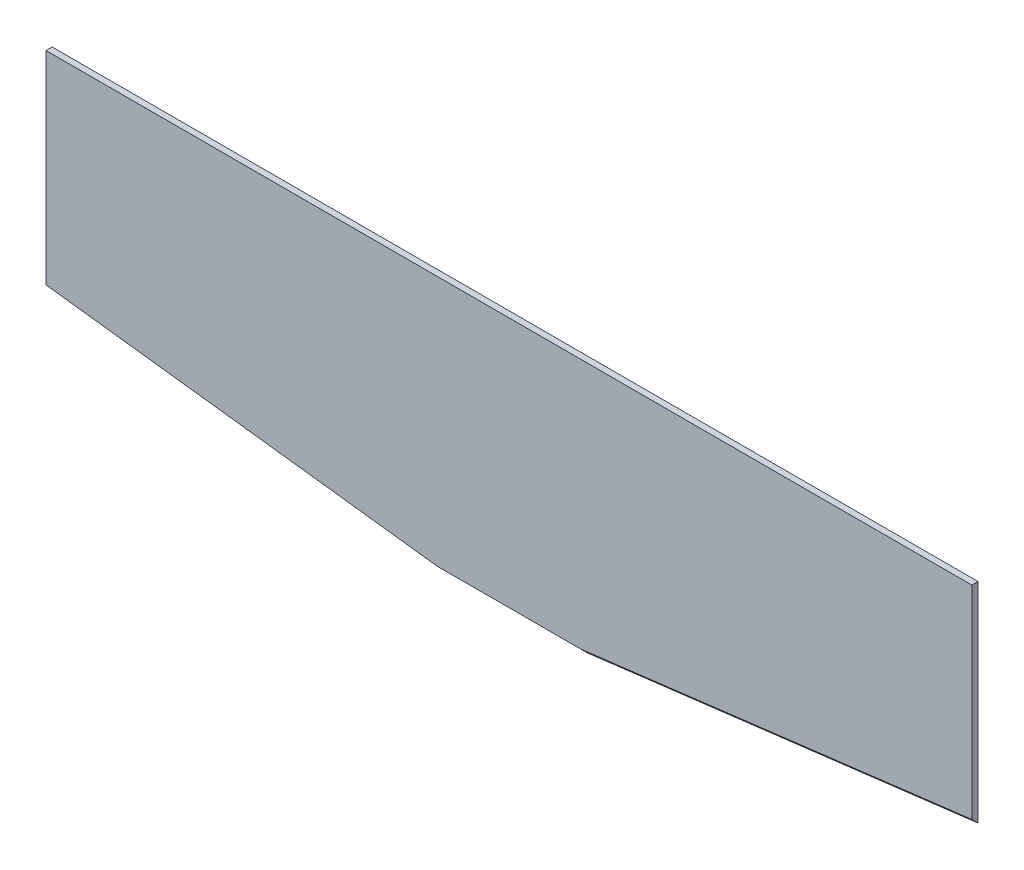
ISO-10303-21;
HEADER;
FILE_DESCRIPTION(('STEP AP214'),'2;1');
FILE_NAME('part.step','',(''),(''),'','','');
FILE_SCHEMA(('AUTOMOTIVE_DESIGN { 1 0 10303 214 1 1 1 1 }'));
ENDSEC;
DATA;
#1=APPLICATION_CONTEXT('core data for automotive mechanical design processes');
#2=APPLICATION_PROTOCOL_DEFINITION('international standard','automotive_design',2000,#1);
#3=PRODUCT_CONTEXT('',#1,'mechanical');
#4=PRODUCT('Part','Part','',(#3));
#5=PRODUCT_RELATED_PRODUCT_CATEGORY('part','',(#4));
#6=PRODUCT_DEFINITION_FORMATION('','',#4);
#7=PRODUCT_DEFINITION_CONTEXT('part definition',#1,'design');
#8=PRODUCT_DEFINITION('design','',#6,#7);
#9=PRODUCT_DEFINITION_SHAPE('','',#8);
#10=(LENGTH_UNIT() NAMED_UNIT(*) SI_UNIT(.MILLI.,.METRE.));
#11=(NAMED_UNIT(*) PLANE_ANGLE_UNIT() SI_UNIT($,.RADIAN.));
#12=(NAMED_UNIT(*) SI_UNIT($,.STERADIAN.) SOLID_ANGLE_UNIT());
#13=UNCERTAINTY_MEASURE_WITH_UNIT(LENGTH_MEASURE(1.E-05),#10,'distance_accuracy_value','');
#14=(GEOMETRIC_REPRESENTATION_CONTEXT(3) GLOBAL_UNCERTAINTY_ASSIGNED_CONTEXT((#13)) GLOBAL_UNIT_ASSIGNED_CONTEXT((#10,
#11,#12)) REPRESENTATION_CONTEXT('',''));
#15=CARTESIAN_POINT('',(0.,0.,0.));
#16=DIRECTION('',(0.,0.,1.));
#17=DIRECTION('',(1.,0.,0.));
#18=AXIS2_PLACEMENT_3D('',#15,#16,#17);
#19=CARTESIAN_POINT('',(-14.,9.,0.6));
#20=DIRECTION('',(1.,0.,0.));
#21=DIRECTION('',(0.,1.,0.));
#22=AXIS2_PLACEMENT_3D('',#19,#20,#21);
#23=PLANE('',#22);
#24=DIRECTION('',(0.,-1.,0.));
#25=VECTOR('',#24,1.);
#26=CARTESIAN_POINT('',(-14.,9.,0.));
#27=LINE('',#26,#25);
#28=CARTESIAN_POINT('',(-14.,9.,0.));
#29=VERTEX_POINT('',#28);
#30=CARTESIAN_POINT('',(-14.,-11.3341866856899,0.));
#31=VERTEX_POINT('',#30);
#32=EDGE_CURVE('E109',#29,#31,#27,.T.);
#33=ORIENTED_EDGE('',*,*,#32,.T.);
#34=DIRECTION('',(0.,0.709747006865423,0.704456660303225));
#35=VECTOR('',#34,1.);
#36=CARTESIAN_POINT('',(-14.,-13.6845472814667,-2.33284136430769));
#37=LINE('',#36,#35);
#38=CARTESIAN_POINT('',(-14.,-10.7296807904146,0.6));
#39=VERTEX_POINT('',#38);
#40=EDGE_CURVE('E11',#31,#39,#37,.T.);
#41=ORIENTED_EDGE('',*,*,#40,.T.);
#42=DIRECTION('',(0.,-1.,0.));
#43=VECTOR('',#42,1.);
#44=CARTESIAN_POINT('',(-14.,9.,0.6));
#45=LINE('',#44,#43);
#46=CARTESIAN_POINT('',(-14.,9.,0.6));
#47=VERTEX_POINT('',#46);
#48=EDGE_CURVE('E133',#47,#39,#45,.T.);
#49=ORIENTED_EDGE('',*,*,#48,.F.);
#50=DIRECTION('',(0.,0.,-1.));
#51=VECTOR('',#50,1.);
#52=CARTESIAN_POINT('',(-14.,9.,0.6));
#53=LINE('',#52,#51);
#54=EDGE_CURVE('E127',#47,#29,#53,.T.);
#55=ORIENTED_EDGE('',*,*,#54,.T.);
#56=EDGE_LOOP('',(#33,#41,#49,#55));
#57=FACE_BOUND('',#56,.T.);
#58=ADVANCED_FACE('F41',(#57),#23,.F.);
#59=CARTESIAN_POINT('',(76.,9.,0.6));
#60=DIRECTION('',(-1.,0.,0.));
#61=DIRECTION('',(0.,0.,1.));
#62=AXIS2_PLACEMENT_3D('',#59,#60,#61);
#63=PLANE('',#62);
#64=DIRECTION('',(0.,1.,0.));
#65=VECTOR('',#64,1.);
#66=CARTESIAN_POINT('',(76.,9.,0.6));
#67=LINE('',#66,#65);
#68=CARTESIAN_POINT('',(76.,-10.7296807904147,0.6));
#69=VERTEX_POINT('',#68);
#70=CARTESIAN_POINT('',(76.,9.,0.6));
#71=VERTEX_POINT('',#70);
#72=EDGE_CURVE('E137',#69,#71,#67,.T.);
#73=ORIENTED_EDGE('',*,*,#72,.F.);
#74=DIRECTION('',(0.,-0.709747006865421,-0.704456660303227));
#75=VECTOR('',#74,1.);
#76=CARTESIAN_POINT('',(76.,-13.6845472814667,-2.33284136430765));
#77=LINE('',#76,#75);
#78=CARTESIAN_POINT('',(76.,-11.33418668569,0.));
#79=VERTEX_POINT('',#78);
#80=EDGE_CURVE('E51',#69,#79,#77,.T.);
#81=ORIENTED_EDGE('',*,*,#80,.T.);
#82=DIRECTION('',(0.,1.,0.));
#83=VECTOR('',#82,1.);
#84=CARTESIAN_POINT('',(76.,9.,0.));
#85=LINE('',#84,#83);
#86=CARTESIAN_POINT('',(76.,9.,0.));
#87=VERTEX_POINT('',#86);
#88=EDGE_CURVE('E108',#79,#87,#85,.T.);
#89=ORIENTED_EDGE('',*,*,#88,.T.);
#90=DIRECTION('',(0.,0.,-1.));
#91=VECTOR('',#90,1.);
#92=CARTESIAN_POINT('',(76.,9.,0.6));
#93=LINE('',#92,#91);
#94=EDGE_CURVE('E124',#71,#87,#93,.T.);
#95=ORIENTED_EDGE('',*,*,#94,.F.);
#96=EDGE_LOOP('',(#73,#81,#89,#95));
#97=FACE_BOUND('',#96,.T.);
#98=ADVANCED_FACE('F150',(#97),#63,.F.);
#99=CARTESIAN_POINT('',(-14.,9.,0.6));
#100=DIRECTION('',(0.,-1.,0.));
#101=DIRECTION('',(0.,0.,-1.));
#102=AXIS2_PLACEMENT_3D('',#99,#100,#101);
#103=PLANE('',#102);
#104=DIRECTION('',(-1.,0.,0.));
#105=VECTOR('',#104,1.);
#106=CARTESIAN_POINT('',(-14.,9.,0.));
#107=LINE('',#106,#105);
#108=EDGE_CURVE('E131',#87,#29,#107,.T.);
#109=ORIENTED_EDGE('',*,*,#108,.T.);
#110=ORIENTED_EDGE('',*,*,#54,.F.);
#111=DIRECTION('',(-1.,0.,0.));
#112=VECTOR('',#111,1.);
#113=CARTESIAN_POINT('',(-14.,9.,0.6));
#114=LINE('',#113,#112);
#115=EDGE_CURVE('E130',#71,#47,#114,.T.);
#116=ORIENTED_EDGE('',*,*,#115,.F.);
#117=ORIENTED_EDGE('',*,*,#94,.T.);
#118=EDGE_LOOP('',(#109,#110,#116,#117));
#119=FACE_BOUND('',#118,.T.);
#120=ADVANCED_FACE('F146',(#119),#103,.F.);
#121=CARTESIAN_POINT('',(0.,0.,0.6));
#122=DIRECTION('',(0.,0.,1.));
#123=DIRECTION('',(1.,0.,0.));
#124=AXIS2_PLACEMENT_3D('',#121,#122,#123);
#125=PLANE('',#124);
#126=DIRECTION('',(1.,0.,0.));
#127=VECTOR('',#126,1.);
#128=CARTESIAN_POINT('',(38.,-15.4,0.6));
#129=LINE('',#128,#127);
#130=CARTESIAN_POINT('',(24.0366975720903,-15.4,0.6));
#131=VERTEX_POINT('',#130);
#132=CARTESIAN_POINT('',(37.9633024279098,-15.4,0.6));
#133=VERTEX_POINT('',#132);
#134=EDGE_CURVE('E59',#131,#133,#129,.T.);
#135=ORIENTED_EDGE('',*,*,#134,.T.);
#136=DIRECTION('',(0.992546151641323,0.121869343405138,0.));
#137=VECTOR('',#136,1.);
#138=CARTESIAN_POINT('',(75.9268783939569,-10.7386589947052,0.6));
#139=LINE('',#138,#137);
#140=EDGE_CURVE('E120',#133,#69,#139,.T.);
#141=ORIENTED_EDGE('',*,*,#140,.T.);
#142=ORIENTED_EDGE('',*,*,#72,.T.);
#143=ORIENTED_EDGE('',*,*,#115,.T.);
#144=ORIENTED_EDGE('',*,*,#48,.T.);
#145=DIRECTION('',(0.992546151641323,-0.121869343405141,0.));
#146=VECTOR('',#145,1.);
#147=CARTESIAN_POINT('',(24.0731216060431,-15.4044723090152,0.6));
#148=LINE('',#147,#146);
#149=EDGE_CURVE('E64',#39,#131,#148,.T.);
#150=ORIENTED_EDGE('',*,*,#149,.T.);
#151=EDGE_LOOP('',(#135,#141,#142,#143,#144,#150));
#152=FACE_BOUND('',#151,.T.);
#153=ADVANCED_FACE('F140',(#152),#125,.T.);
#154=CARTESIAN_POINT('',(0.,0.,0.));
#155=DIRECTION('',(0.,0.,1.));
#156=DIRECTION('',(1.,0.,0.));
#157=AXIS2_PLACEMENT_3D('',#154,#155,#156);
#158=PLANE('',#157);
#159=DIRECTION('',(1.,0.,0.));
#160=VECTOR('',#159,1.);
#161=CARTESIAN_POINT('',(-14.,-16.,0.));
#162=LINE('',#161,#160);
#163=CARTESIAN_POINT('',(23.9999999999996,-16.,0.));
#164=VERTEX_POINT('',#163);
#165=CARTESIAN_POINT('',(38.,-16.,0.));
#166=VERTEX_POINT('',#165);
#167=EDGE_CURVE('E96',#164,#166,#162,.T.);
#168=ORIENTED_EDGE('',*,*,#167,.F.);
#169=DIRECTION('',(0.992546151641323,-0.121869343405141,0.));
#170=VECTOR('',#169,1.);
#171=CARTESIAN_POINT('',(24.,-16.,0.));
#172=LINE('',#171,#170);
#173=EDGE_CURVE('E100',#31,#164,#172,.T.);
#174=ORIENTED_EDGE('',*,*,#173,.F.);
#175=ORIENTED_EDGE('',*,*,#32,.F.);
#176=ORIENTED_EDGE('',*,*,#108,.F.);
#177=ORIENTED_EDGE('',*,*,#88,.F.);
#178=DIRECTION('',(0.992546151641323,0.121869343405138,0.));
#179=VECTOR('',#178,1.);
#180=CARTESIAN_POINT('',(38.,-16.,0.));
#181=LINE('',#180,#179);
#182=EDGE_CURVE('E104',#166,#79,#181,.T.);
#183=ORIENTED_EDGE('',*,*,#182,.F.);
#184=EDGE_LOOP('',(#168,#174,#175,#176,#177,#183));
#185=FACE_BOUND('',#184,.T.);
#186=ADVANCED_FACE('F98',(#185),#158,.F.);
#187=CARTESIAN_POINT('',(24.,-16.,0.));
#188=DIRECTION('',(-0.086174639140527,-0.701836114466191,0.707106781186547));
#189=DIRECTION('',(0.992546151641323,-0.121869343405141,0.));
#190=AXIS2_PLACEMENT_3D('',#187,#188,#189);
#191=PLANE('',#190);
#192=ORIENTED_EDGE('',*,*,#40,.F.);
#193=ORIENTED_EDGE('',*,*,#173,.T.);
#194=DIRECTION('',(-0.0432081133997333,-0.706446409480732,-0.706446409480732));
#195=VECTOR('',#194,1.);
#196=CARTESIAN_POINT('',(23.9918224743605,-16.1337013623584,-0.133701362358408));
#197=LINE('',#196,#195);
#198=EDGE_CURVE('E46',#131,#164,#197,.T.);
#199=ORIENTED_EDGE('',*,*,#198,.F.);
#200=ORIENTED_EDGE('',*,*,#149,.F.);
#201=EDGE_LOOP('',(#192,#193,#199,#200));
#202=FACE_BOUND('',#201,.T.);
#203=ADVANCED_FACE('F44',(#202),#191,.T.);
#204=CARTESIAN_POINT('',(0.,-15.4,0.6));
#205=DIRECTION('',(0.,-0.707106781186548,0.707106781186548));
#206=DIRECTION('',(-1.,0.,0.));
#207=AXIS2_PLACEMENT_3D('',#204,#205,#206);
#208=PLANE('',#207);
#209=ORIENTED_EDGE('',*,*,#198,.T.);
#210=ORIENTED_EDGE('',*,*,#167,.T.);
#211=DIRECTION('',(-0.0432081133996967,0.706446409480733,0.706446409480733));
#212=VECTOR('',#211,1.);
#213=CARTESIAN_POINT('',(37.8924271796988,-14.2411999349154,1.75880006508465));
#214=LINE('',#213,#212);
#215=EDGE_CURVE('E115',#133,#166,#214,.F.);
#216=ORIENTED_EDGE('',*,*,#215,.F.);
#217=ORIENTED_EDGE('',*,*,#134,.F.);
#218=EDGE_LOOP('',(#209,#210,#216,#217));
#219=FACE_BOUND('',#218,.T.);
#220=ADVANCED_FACE('F114',(#219),#208,.T.);
#221=CARTESIAN_POINT('',(38.,-16.,0.));
#222=DIRECTION('',(0.0861746391405257,-0.701836114466193,0.707106781186545));
#223=DIRECTION('',(0.992546151641323,0.121869343405138,0.));
#224=AXIS2_PLACEMENT_3D('',#221,#222,#223);
#225=PLANE('',#224);
#226=ORIENTED_EDGE('',*,*,#80,.F.);
#227=ORIENTED_EDGE('',*,*,#140,.F.);
#228=ORIENTED_EDGE('',*,*,#215,.T.);
#229=ORIENTED_EDGE('',*,*,#182,.T.);
#230=EDGE_LOOP('',(#226,#227,#228,#229));
#231=FACE_BOUND('',#230,.T.);
#232=ADVANCED_FACE('F152',(#231),#225,.T.);
#233=CLOSED_SHELL('',(#58,#98,#120,#153,#186,#203,#220,#232));
#234=MANIFOLD_SOLID_BREP('B2',#233);
#235=ADVANCED_BREP_SHAPE_REPRESENTATION('',(#18,#234),#14);
#236=SHAPE_DEFINITION_REPRESENTATION(#9,#235);
ENDSEC;
END-ISO-10303-21;
